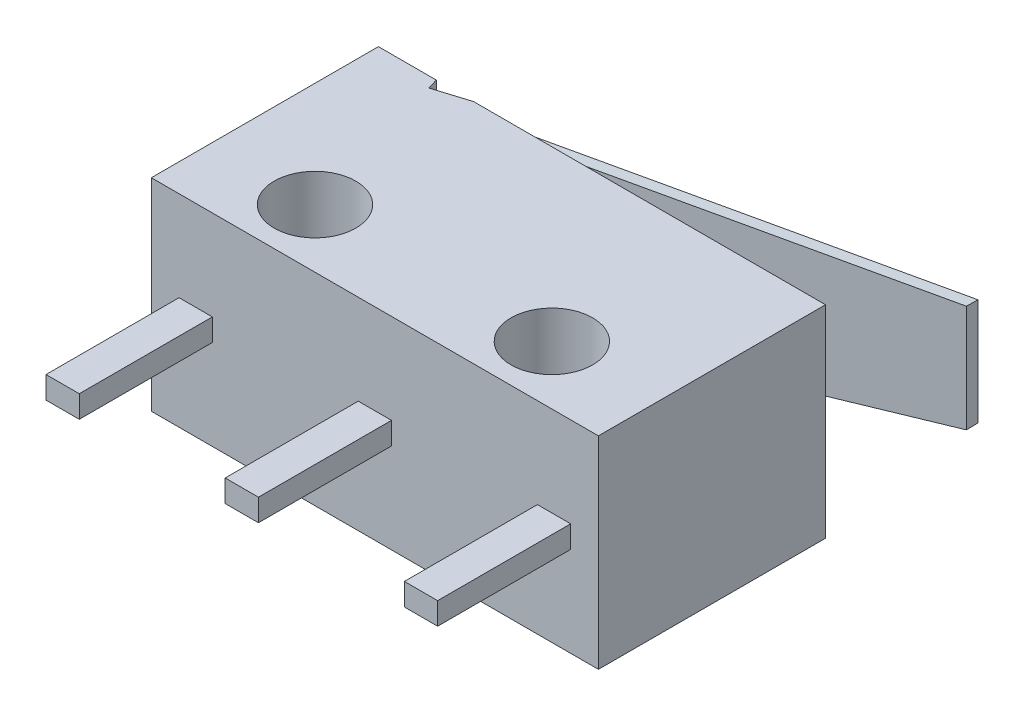
ISO-10303-21;
HEADER;
FILE_DESCRIPTION(('STEP AP214'),'2;1');
FILE_NAME('part.step','',(''),(''),'','','');
FILE_SCHEMA(('AUTOMOTIVE_DESIGN { 1 0 10303 214 1 1 1 1 }'));
ENDSEC;
DATA;
#1=APPLICATION_CONTEXT('core data for automotive mechanical design processes');
#2=APPLICATION_PROTOCOL_DEFINITION('international standard','automotive_design',2000,#1);
#3=PRODUCT_CONTEXT('',#1,'mechanical');
#4=PRODUCT('Part','Part','',(#3));
#5=PRODUCT_RELATED_PRODUCT_CATEGORY('part','',(#4));
#6=PRODUCT_DEFINITION_FORMATION('','',#4);
#7=PRODUCT_DEFINITION_CONTEXT('part definition',#1,'design');
#8=PRODUCT_DEFINITION('design','',#6,#7);
#9=PRODUCT_DEFINITION_SHAPE('','',#8);
#10=(LENGTH_UNIT() NAMED_UNIT(*) SI_UNIT(.MILLI.,.METRE.));
#11=(NAMED_UNIT(*) PLANE_ANGLE_UNIT() SI_UNIT($,.RADIAN.));
#12=(NAMED_UNIT(*) SI_UNIT($,.STERADIAN.) SOLID_ANGLE_UNIT());
#13=UNCERTAINTY_MEASURE_WITH_UNIT(LENGTH_MEASURE(1.E-05),#10,'distance_accuracy_value','');
#14=(GEOMETRIC_REPRESENTATION_CONTEXT(3) GLOBAL_UNCERTAINTY_ASSIGNED_CONTEXT((#13)) GLOBAL_UNIT_ASSIGNED_CONTEXT((#10,
#11,#12)) REPRESENTATION_CONTEXT('',''));
#15=CARTESIAN_POINT('',(0.,0.,0.));
#16=DIRECTION('',(0.,0.,1.));
#17=DIRECTION('',(1.,0.,0.));
#18=AXIS2_PLACEMENT_3D('',#15,#16,#17);
#19=CARTESIAN_POINT('',(-6.4008,5.7912,3.2512));
#20=DIRECTION('',(0.,0.,-1.));
#21=DIRECTION('',(-1.,0.,0.));
#22=AXIS2_PLACEMENT_3D('',#19,#20,#21);
#23=PLANE('',#22);
#24=DIRECTION('',(0.,1.,0.));
#25=VECTOR('',#24,1.);
#26=CARTESIAN_POINT('',(-4.65455,3.2131,3.2512));
#27=LINE('',#26,#25);
#28=CARTESIAN_POINT('',(-4.65455,2.5781,3.2512));
#29=VERTEX_POINT('',#28);
#30=CARTESIAN_POINT('',(-4.65455,3.2131,3.2512));
#31=VERTEX_POINT('',#30);
#32=EDGE_CURVE('E329',#29,#31,#27,.T.);
#33=ORIENTED_EDGE('',*,*,#32,.F.);
#34=DIRECTION('',(1.,0.,0.));
#35=VECTOR('',#34,1.);
#36=CARTESIAN_POINT('',(-5.60705,2.5781,3.2512));
#37=LINE('',#36,#35);
#38=CARTESIAN_POINT('',(-5.60705,2.5781,3.2512));
#39=VERTEX_POINT('',#38);
#40=EDGE_CURVE('E347',#39,#29,#37,.T.);
#41=ORIENTED_EDGE('',*,*,#40,.F.);
#42=DIRECTION('',(0.,-1.,0.));
#43=VECTOR('',#42,1.);
#44=CARTESIAN_POINT('',(-5.60705,3.2131,3.2512));
#45=LINE('',#44,#43);
#46=CARTESIAN_POINT('',(-5.60705,3.2131,3.2512));
#47=VERTEX_POINT('',#46);
#48=EDGE_CURVE('E360',#47,#39,#45,.T.);
#49=ORIENTED_EDGE('',*,*,#48,.F.);
#50=DIRECTION('',(-1.,0.,0.));
#51=VECTOR('',#50,1.);
#52=CARTESIAN_POINT('',(-5.60705,3.2131,3.2512));
#53=LINE('',#52,#51);
#54=EDGE_CURVE('E335',#31,#47,#53,.T.);
#55=ORIENTED_EDGE('',*,*,#54,.F.);
#56=EDGE_LOOP('',(#33,#41,#49,#55));
#57=FACE_BOUND('',#56,.T.);
#58=DIRECTION('',(1.,0.,0.));
#59=VECTOR('',#58,1.);
#60=CARTESIAN_POINT('',(-6.4008,0.,3.2512));
#61=LINE('',#60,#59);
#62=CARTESIAN_POINT('',(-6.4008,0.,3.2512));
#63=VERTEX_POINT('',#62);
#64=CARTESIAN_POINT('',(6.4008,0.,3.2512));
#65=VERTEX_POINT('',#64);
#66=EDGE_CURVE('E587',#63,#65,#61,.T.);
#67=ORIENTED_EDGE('',*,*,#66,.T.);
#68=DIRECTION('',(0.,-1.,0.));
#69=VECTOR('',#68,1.);
#70=CARTESIAN_POINT('',(6.4008,5.7912,3.2512));
#71=LINE('',#70,#69);
#72=CARTESIAN_POINT('',(6.4008,5.7912,3.2512));
#73=VERTEX_POINT('',#72);
#74=EDGE_CURVE('E597',#73,#65,#71,.T.);
#75=ORIENTED_EDGE('',*,*,#74,.F.);
#76=DIRECTION('',(1.,0.,0.));
#77=VECTOR('',#76,1.);
#78=CARTESIAN_POINT('',(-6.4008,5.7912,3.2512));
#79=LINE('',#78,#77);
#80=CARTESIAN_POINT('',(-6.4008,5.7912,3.2512));
#81=VERTEX_POINT('',#80);
#82=EDGE_CURVE('E594',#81,#73,#79,.T.);
#83=ORIENTED_EDGE('',*,*,#82,.F.);
#84=DIRECTION('',(0.,-1.,0.));
#85=VECTOR('',#84,1.);
#86=CARTESIAN_POINT('',(-6.4008,5.7912,3.2512));
#87=LINE('',#86,#85);
#88=EDGE_CURVE('E614',#81,#63,#87,.T.);
#89=ORIENTED_EDGE('',*,*,#88,.T.);
#90=EDGE_LOOP('',(#67,#75,#83,#89));
#91=FACE_BOUND('',#90,.T.);
#92=DIRECTION('',(0.,1.,0.));
#93=VECTOR('',#92,1.);
#94=CARTESIAN_POINT('',(0.476249999999998,3.2131,3.2512));
#95=LINE('',#94,#93);
#96=CARTESIAN_POINT('',(0.476249999999998,2.5781,3.2512));
#97=VERTEX_POINT('',#96);
#98=CARTESIAN_POINT('',(0.476249999999998,3.2131,3.2512));
#99=VERTEX_POINT('',#98);
#100=EDGE_CURVE('E382',#97,#99,#95,.T.);
#101=ORIENTED_EDGE('',*,*,#100,.F.);
#102=DIRECTION('',(1.,0.,0.));
#103=VECTOR('',#102,1.);
#104=CARTESIAN_POINT('',(-0.476250000000003,2.5781,3.2512));
#105=LINE('',#104,#103);
#106=CARTESIAN_POINT('',(-0.476250000000003,2.5781,3.2512));
#107=VERTEX_POINT('',#106);
#108=EDGE_CURVE('E388',#107,#97,#105,.T.);
#109=ORIENTED_EDGE('',*,*,#108,.F.);
#110=DIRECTION('',(0.,-1.,0.));
#111=VECTOR('',#110,1.);
#112=CARTESIAN_POINT('',(-0.476250000000002,3.2131,3.2512));
#113=LINE('',#112,#111);
#114=CARTESIAN_POINT('',(-0.476250000000002,3.2131,3.2512));
#115=VERTEX_POINT('',#114);
#116=EDGE_CURVE('E405',#115,#107,#113,.T.);
#117=ORIENTED_EDGE('',*,*,#116,.F.);
#118=DIRECTION('',(-1.,0.,0.));
#119=VECTOR('',#118,1.);
#120=CARTESIAN_POINT('',(-0.476250000000002,3.2131,3.2512));
#121=LINE('',#120,#119);
#122=EDGE_CURVE('E401',#99,#115,#121,.T.);
#123=ORIENTED_EDGE('',*,*,#122,.F.);
#124=EDGE_LOOP('',(#101,#109,#117,#123));
#125=FACE_BOUND('',#124,.T.);
#126=DIRECTION('',(0.,1.,0.));
#127=VECTOR('',#126,1.);
#128=CARTESIAN_POINT('',(5.60705,3.2131,3.2512));
#129=LINE('',#128,#127);
#130=CARTESIAN_POINT('',(5.60705,2.5781,3.2512));
#131=VERTEX_POINT('',#130);
#132=CARTESIAN_POINT('',(5.60705,3.2131,3.2512));
#133=VERTEX_POINT('',#132);
#134=EDGE_CURVE('E327',#131,#133,#129,.T.);
#135=ORIENTED_EDGE('',*,*,#134,.F.);
#136=DIRECTION('',(1.,0.,0.));
#137=VECTOR('',#136,1.);
#138=CARTESIAN_POINT('',(5.60705,2.5781,3.2512));
#139=LINE('',#138,#137);
#140=CARTESIAN_POINT('',(4.65455,2.5781,3.2512));
#141=VERTEX_POINT('',#140);
#142=EDGE_CURVE('E324',#141,#131,#139,.T.);
#143=ORIENTED_EDGE('',*,*,#142,.F.);
#144=DIRECTION('',(0.,-1.,0.));
#145=VECTOR('',#144,1.);
#146=CARTESIAN_POINT('',(4.65455,3.2131,3.2512));
#147=LINE('',#146,#145);
#148=CARTESIAN_POINT('',(4.65455,3.2131,3.2512));
#149=VERTEX_POINT('',#148);
#150=EDGE_CURVE('E66',#149,#141,#147,.T.);
#151=ORIENTED_EDGE('',*,*,#150,.F.);
#152=DIRECTION('',(-1.,0.,0.));
#153=VECTOR('',#152,1.);
#154=CARTESIAN_POINT('',(5.60705,3.2131,3.2512));
#155=LINE('',#154,#153);
#156=EDGE_CURVE('E58',#133,#149,#155,.T.);
#157=ORIENTED_EDGE('',*,*,#156,.F.);
#158=EDGE_LOOP('',(#135,#143,#151,#157));
#159=FACE_BOUND('',#158,.T.);
#160=ADVANCED_FACE('F39',(#57,#91,#125,#159),#23,.F.);
#161=CARTESIAN_POINT('',(-6.4008,5.7912,-3.2512));
#162=DIRECTION('',(0.,0.,1.));
#163=DIRECTION('',(1.,0.,0.));
#164=AXIS2_PLACEMENT_3D('',#161,#162,#163);
#165=PLANE('',#164);
#166=DIRECTION('',(1.,0.,0.));
#167=VECTOR('',#166,1.);
#168=CARTESIAN_POINT('',(-1.4478,4.6736,-3.2512));
#169=LINE('',#168,#167);
#170=CARTESIAN_POINT('',(-2.4638,4.6736,-3.2512));
#171=VERTEX_POINT('',#170);
#172=CARTESIAN_POINT('',(-1.4478,4.6736,-3.2512));
#173=VERTEX_POINT('',#172);
#174=EDGE_CURVE('E554',#171,#173,#169,.T.);
#175=ORIENTED_EDGE('',*,*,#174,.F.);
#176=DIRECTION('',(0.,1.,0.));
#177=VECTOR('',#176,1.);
#178=CARTESIAN_POINT('',(-2.4638,4.6736,-3.2512));
#179=LINE('',#178,#177);
#180=CARTESIAN_POINT('',(-2.4638,1.1176,-3.2512));
#181=VERTEX_POINT('',#180);
#182=EDGE_CURVE('E551',#181,#171,#179,.T.);
#183=ORIENTED_EDGE('',*,*,#182,.F.);
#184=DIRECTION('',(-1.,0.,0.));
#185=VECTOR('',#184,1.);
#186=CARTESIAN_POINT('',(-1.4478,1.1176,-3.2512));
#187=LINE('',#186,#185);
#188=CARTESIAN_POINT('',(-1.4478,1.1176,-3.2512));
#189=VERTEX_POINT('',#188);
#190=EDGE_CURVE('E561',#189,#181,#187,.T.);
#191=ORIENTED_EDGE('',*,*,#190,.F.);
#192=DIRECTION('',(0.,-1.,0.));
#193=VECTOR('',#192,1.);
#194=CARTESIAN_POINT('',(-1.4478,4.6736,-3.2512));
#195=LINE('',#194,#193);
#196=EDGE_CURVE('E558',#173,#189,#195,.T.);
#197=ORIENTED_EDGE('',*,*,#196,.F.);
#198=EDGE_LOOP('',(#175,#183,#191,#197));
#199=FACE_BOUND('',#198,.T.);
#200=DIRECTION('',(-1.,0.,0.));
#201=VECTOR('',#200,1.);
#202=CARTESIAN_POINT('',(-6.4008,0.,-3.2512));
#203=LINE('',#202,#201);
#204=CARTESIAN_POINT('',(6.4008,0.,-3.2512));
#205=VERTEX_POINT('',#204);
#206=CARTESIAN_POINT('',(-3.67341299428103,0.,-3.2512));
#207=VERTEX_POINT('',#206);
#208=EDGE_CURVE('E602',#205,#207,#203,.T.);
#209=ORIENTED_EDGE('',*,*,#208,.T.);
#210=DIRECTION('',(0.,1.,0.));
#211=VECTOR('',#210,1.);
#212=CARTESIAN_POINT('',(-3.67341299428103,-12.393877288843,-3.2512));
#213=LINE('',#212,#211);
#214=CARTESIAN_POINT('',(-3.67341299428103,0.583500613824504,-3.2512));
#215=VERTEX_POINT('',#214);
#216=EDGE_CURVE('E530',#207,#215,#213,.T.);
#217=ORIENTED_EDGE('',*,*,#216,.T.);
#218=CARTESIAN_POINT('',(-3.67341299428104,1.79809398566603,-3.2512));
#219=VERTEX_POINT('',#218);
#220=EDGE_CURVE('E534',#215,#219,#213,.T.);
#221=ORIENTED_EDGE('',*,*,#220,.T.);
#222=CARTESIAN_POINT('',(-3.67341299428103,3.99310601433397,-3.2512));
#223=VERTEX_POINT('',#222);
#224=EDGE_CURVE('E687',#219,#223,#213,.T.);
#225=ORIENTED_EDGE('',*,*,#224,.T.);
#226=CARTESIAN_POINT('',(-3.67341299428103,5.2076993861755,-3.2512));
#227=VERTEX_POINT('',#226);
#228=EDGE_CURVE('E691',#223,#227,#213,.T.);
#229=ORIENTED_EDGE('',*,*,#228,.T.);
#230=CARTESIAN_POINT('',(-3.67341299428103,5.7912,-3.2512));
#231=VERTEX_POINT('',#230);
#232=EDGE_CURVE('E535',#227,#231,#213,.T.);
#233=ORIENTED_EDGE('',*,*,#232,.T.);
#234=DIRECTION('',(-1.,0.,0.));
#235=VECTOR('',#234,1.);
#236=CARTESIAN_POINT('',(-6.4008,5.7912,-3.2512));
#237=LINE('',#236,#235);
#238=CARTESIAN_POINT('',(6.4008,5.7912,-3.2512));
#239=VERTEX_POINT('',#238);
#240=EDGE_CURVE('E588',#239,#231,#237,.T.);
#241=ORIENTED_EDGE('',*,*,#240,.F.);
#242=DIRECTION('',(0.,-1.,0.));
#243=VECTOR('',#242,1.);
#244=CARTESIAN_POINT('',(6.4008,5.7912,-3.2512));
#245=LINE('',#244,#243);
#246=EDGE_CURVE('E11',#239,#205,#245,.T.);
#247=ORIENTED_EDGE('',*,*,#246,.T.);
#248=EDGE_LOOP('',(#209,#217,#221,#225,#229,#233,#241,#247));
#249=FACE_BOUND('',#248,.T.);
#250=ADVANCED_FACE('F703',(#199,#249),#165,.F.);
#251=CARTESIAN_POINT('',(-4.74408917190015,5.7912,-3.2512));
#252=VERTEX_POINT('',#251);
#253=CARTESIAN_POINT('',(-6.4008,5.7912,-3.2512));
#254=VERTEX_POINT('',#253);
#255=EDGE_CURVE('E586',#252,#254,#237,.T.);
#256=ORIENTED_EDGE('',*,*,#255,.F.);
#257=DIRECTION('',(0.,1.,0.));
#258=VECTOR('',#257,1.);
#259=CARTESIAN_POINT('',(-4.74408917190015,5.27828827236032,-3.2512));
#260=LINE('',#259,#258);
#261=CARTESIAN_POINT('',(-4.74408917190015,5.27828827236032,-3.2512));
#262=VERTEX_POINT('',#261);
#263=EDGE_CURVE('E428',#262,#252,#260,.T.);
#264=ORIENTED_EDGE('',*,*,#263,.F.);
#265=DIRECTION('',(0.,1.,0.));
#266=VECTOR('',#265,1.);
#267=CARTESIAN_POINT('',(-4.74408917190015,-12.393877288843,-3.2512));
#268=LINE('',#267,#266);
#269=CARTESIAN_POINT('',(-4.74408917190015,4.10181579910241,-3.2512));
#270=VERTEX_POINT('',#269);
#271=EDGE_CURVE('E541',#270,#262,#268,.T.);
#272=ORIENTED_EDGE('',*,*,#271,.F.);
#273=DIRECTION('',(0.,1.,0.));
#274=VECTOR('',#273,1.);
#275=CARTESIAN_POINT('',(-4.74408917190015,1.68938420089759,-3.2512));
#276=LINE('',#275,#274);
#277=CARTESIAN_POINT('',(-4.74408917190015,1.68938420089759,-3.2512));
#278=VERTEX_POINT('',#277);
#279=EDGE_CURVE('E455',#278,#270,#276,.T.);
#280=ORIENTED_EDGE('',*,*,#279,.F.);
#281=CARTESIAN_POINT('',(-4.74408917190015,0.512911727639676,-3.2512));
#282=VERTEX_POINT('',#281);
#283=EDGE_CURVE('E540',#282,#278,#268,.T.);
#284=ORIENTED_EDGE('',*,*,#283,.F.);
#285=CARTESIAN_POINT('',(-4.74408917190015,0.,-3.2512));
#286=VERTEX_POINT('',#285);
#287=EDGE_CURVE('E536',#286,#282,#268,.T.);
#288=ORIENTED_EDGE('',*,*,#287,.F.);
#289=CARTESIAN_POINT('',(-6.4008,0.,-3.2512));
#290=VERTEX_POINT('',#289);
#291=EDGE_CURVE('E601',#286,#290,#203,.T.);
#292=ORIENTED_EDGE('',*,*,#291,.T.);
#293=DIRECTION('',(0.,-1.,0.));
#294=VECTOR('',#293,1.);
#295=CARTESIAN_POINT('',(-6.4008,5.7912,-3.2512));
#296=LINE('',#295,#294);
#297=EDGE_CURVE('E48',#254,#290,#296,.T.);
#298=ORIENTED_EDGE('',*,*,#297,.F.);
#299=EDGE_LOOP('',(#256,#264,#272,#280,#284,#288,#292,#298));
#300=FACE_BOUND('',#299,.T.);
#301=ADVANCED_FACE('F648',(#300),#165,.F.);
#302=CARTESIAN_POINT('',(6.4008,5.7912,3.2512));
#303=DIRECTION('',(0.,1.,0.));
#304=DIRECTION('',(0.,0.,1.));
#305=AXIS2_PLACEMENT_3D('',#302,#303,#304);
#306=PLANE('',#305);
#307=DIRECTION('',(0.955019944457186,0.,-0.296541574975572));
#308=VECTOR('',#307,1.);
#309=CARTESIAN_POINT('',(-4.64993722184541,5.7912,-2.94798116763484));
#310=LINE('',#309,#308);
#311=CARTESIAN_POINT('',(-4.64993722184541,5.7912,-2.94798116763484));
#312=VERTEX_POINT('',#311);
#313=EDGE_CURVE('E443',#312,#231,#310,.T.);
#314=ORIENTED_EDGE('',*,*,#313,.F.);
#315=DIRECTION('',(-0.296541574975572,0.,-0.955019944457186));
#316=VECTOR('',#315,1.);
#317=CARTESIAN_POINT('',(-0.952300044516491,5.7912,8.96035664977368));
#318=LINE('',#317,#316);
#319=EDGE_CURVE('E438',#312,#252,#318,.T.);
#320=ORIENTED_EDGE('',*,*,#319,.T.);
#321=ORIENTED_EDGE('',*,*,#255,.T.);
#322=DIRECTION('',(0.,0.,1.));
#323=VECTOR('',#322,1.);
#324=CARTESIAN_POINT('',(-6.4008,5.7912,-3.2512));
#325=LINE('',#324,#323);
#326=EDGE_CURVE('E591',#254,#81,#325,.T.);
#327=ORIENTED_EDGE('',*,*,#326,.T.);
#328=ORIENTED_EDGE('',*,*,#82,.T.);
#329=DIRECTION('',(0.,0.,-1.));
#330=VECTOR('',#329,1.);
#331=CARTESIAN_POINT('',(6.4008,5.7912,-3.2512));
#332=LINE('',#331,#330);
#333=EDGE_CURVE('E582',#73,#239,#332,.T.);
#334=ORIENTED_EDGE('',*,*,#333,.T.);
#335=ORIENTED_EDGE('',*,*,#240,.T.);
#336=EDGE_LOOP('',(#314,#320,#321,#327,#328,#334,#335));
#337=FACE_BOUND('',#336,.T.);
#338=CARTESIAN_POINT('',(3.3909,5.7912,1.5748));
#339=DIRECTION('',(0.,1.,0.));
#340=DIRECTION('',(0.,0.,1.));
#341=AXIS2_PLACEMENT_3D('',#338,#339,#340);
#342=CIRCLE('',#341,1.1684);
#343=CARTESIAN_POINT('',(3.3909,5.7912,2.7432));
#344=VERTEX_POINT('',#343);
#345=EDGE_CURVE('E574',#344,#344,#342,.T.);
#346=ORIENTED_EDGE('',*,*,#345,.F.);
#347=EDGE_LOOP('',(#346));
#348=FACE_BOUND('',#347,.T.);
#349=CARTESIAN_POINT('',(-3.3909,5.7912,1.5748));
#350=DIRECTION('',(0.,1.,0.));
#351=DIRECTION('',(0.,0.,-1.));
#352=AXIS2_PLACEMENT_3D('',#349,#350,#351);
#353=CIRCLE('',#352,1.1684);
#354=CARTESIAN_POINT('',(-3.3909,5.7912,0.406400000000002));
#355=VERTEX_POINT('',#354);
#356=EDGE_CURVE('E566',#355,#355,#353,.T.);
#357=ORIENTED_EDGE('',*,*,#356,.F.);
#358=EDGE_LOOP('',(#357));
#359=FACE_BOUND('',#358,.T.);
#360=ADVANCED_FACE('F644',(#337,#348,#359),#306,.T.);
#361=CARTESIAN_POINT('',(6.4008,0.,3.2512));
#362=DIRECTION('',(0.,1.,0.));
#363=DIRECTION('',(0.,0.,1.));
#364=AXIS2_PLACEMENT_3D('',#361,#362,#363);
#365=PLANE('',#364);
#366=CARTESIAN_POINT('',(3.3909,0.,1.5748));
#367=DIRECTION('',(0.,1.,0.));
#368=DIRECTION('',(0.,0.,1.));
#369=AXIS2_PLACEMENT_3D('',#366,#367,#368);
#370=CIRCLE('',#369,1.1684);
#371=CARTESIAN_POINT('',(3.3909,0.,2.7432));
#372=VERTEX_POINT('',#371);
#373=EDGE_CURVE('E570',#372,#372,#370,.T.);
#374=ORIENTED_EDGE('',*,*,#373,.T.);
#375=EDGE_LOOP('',(#374));
#376=FACE_BOUND('',#375,.T.);
#377=DIRECTION('',(-0.296541574975572,0.,-0.955019944457186));
#378=VECTOR('',#377,1.);
#379=CARTESIAN_POINT('',(-0.952300044516491,0.,8.96035664977368));
#380=LINE('',#379,#378);
#381=CARTESIAN_POINT('',(-4.64993722184541,0.,-2.94798116763484));
#382=VERTEX_POINT('',#381);
#383=EDGE_CURVE('E514',#382,#286,#380,.T.);
#384=ORIENTED_EDGE('',*,*,#383,.F.);
#385=DIRECTION('',(-0.955019944457186,0.,0.296541574975572));
#386=VECTOR('',#385,1.);
#387=CARTESIAN_POINT('',(-4.64993722184541,0.,-2.94798116763484));
#388=LINE('',#387,#386);
#389=EDGE_CURVE('E508',#207,#382,#388,.T.);
#390=ORIENTED_EDGE('',*,*,#389,.F.);
#391=ORIENTED_EDGE('',*,*,#208,.F.);
#392=DIRECTION('',(0.,0.,-1.));
#393=VECTOR('',#392,1.);
#394=CARTESIAN_POINT('',(6.4008,0.,-3.2512));
#395=LINE('',#394,#393);
#396=EDGE_CURVE('E578',#65,#205,#395,.T.);
#397=ORIENTED_EDGE('',*,*,#396,.F.);
#398=ORIENTED_EDGE('',*,*,#66,.F.);
#399=DIRECTION('',(0.,0.,1.));
#400=VECTOR('',#399,1.);
#401=CARTESIAN_POINT('',(-6.4008,0.,-3.2512));
#402=LINE('',#401,#400);
#403=EDGE_CURVE('E606',#290,#63,#402,.T.);
#404=ORIENTED_EDGE('',*,*,#403,.F.);
#405=ORIENTED_EDGE('',*,*,#291,.F.);
#406=EDGE_LOOP('',(#384,#390,#391,#397,#398,#404,#405));
#407=FACE_BOUND('',#406,.T.);
#408=CARTESIAN_POINT('',(-3.3909,0.,1.5748));
#409=DIRECTION('',(0.,1.,0.));
#410=DIRECTION('',(0.,0.,-1.));
#411=AXIS2_PLACEMENT_3D('',#408,#409,#410);
#412=CIRCLE('',#411,1.1684);
#413=CARTESIAN_POINT('',(-3.3909,0.,0.406400000000002));
#414=VERTEX_POINT('',#413);
#415=EDGE_CURVE('E565',#414,#414,#412,.T.);
#416=ORIENTED_EDGE('',*,*,#415,.T.);
#417=EDGE_LOOP('',(#416));
#418=FACE_BOUND('',#417,.T.);
#419=ADVANCED_FACE('F631',(#376,#407,#418),#365,.F.);
#420=CARTESIAN_POINT('',(6.4008,5.7912,-3.2512));
#421=DIRECTION('',(-1.,0.,0.));
#422=DIRECTION('',(0.,0.,1.));
#423=AXIS2_PLACEMENT_3D('',#420,#421,#422);
#424=PLANE('',#423);
#425=ORIENTED_EDGE('',*,*,#396,.T.);
#426=ORIENTED_EDGE('',*,*,#246,.F.);
#427=ORIENTED_EDGE('',*,*,#333,.F.);
#428=ORIENTED_EDGE('',*,*,#74,.T.);
#429=EDGE_LOOP('',(#425,#426,#427,#428));
#430=FACE_BOUND('',#429,.T.);
#431=ADVANCED_FACE('F41',(#430),#424,.F.);
#432=CARTESIAN_POINT('',(-6.4008,5.7912,-3.2512));
#433=DIRECTION('',(1.,0.,0.));
#434=DIRECTION('',(0.,0.,-1.));
#435=AXIS2_PLACEMENT_3D('',#432,#433,#434);
#436=PLANE('',#435);
#437=ORIENTED_EDGE('',*,*,#403,.T.);
#438=ORIENTED_EDGE('',*,*,#88,.F.);
#439=ORIENTED_EDGE('',*,*,#326,.F.);
#440=ORIENTED_EDGE('',*,*,#297,.T.);
#441=EDGE_LOOP('',(#437,#438,#439,#440));
#442=FACE_BOUND('',#441,.T.);
#443=ADVANCED_FACE('F623',(#442),#436,.F.);
#444=CARTESIAN_POINT('',(3.3909,5.7912,1.5748));
#445=DIRECTION('',(0.,-1.,0.));
#446=DIRECTION('',(0.,0.,-1.));
#447=AXIS2_PLACEMENT_3D('',#444,#445,#446);
#448=CYLINDRICAL_SURFACE('',#447,1.1684);
#449=ORIENTED_EDGE('',*,*,#345,.T.);
#450=EDGE_LOOP('',(#449));
#451=FACE_BOUND('',#450,.T.);
#452=ORIENTED_EDGE('',*,*,#373,.F.);
#453=EDGE_LOOP('',(#452));
#454=FACE_BOUND('',#453,.T.);
#455=ADVANCED_FACE('F742',(#451,#454),#448,.F.);
#456=CARTESIAN_POINT('',(-3.3909,5.7912,1.5748));
#457=DIRECTION('',(0.,-1.,0.));
#458=DIRECTION('',(0.,0.,-1.));
#459=AXIS2_PLACEMENT_3D('',#456,#457,#458);
#460=CYLINDRICAL_SURFACE('',#459,1.1684);
#461=ORIENTED_EDGE('',*,*,#356,.T.);
#462=EDGE_LOOP('',(#461));
#463=FACE_BOUND('',#462,.T.);
#464=ORIENTED_EDGE('',*,*,#415,.F.);
#465=EDGE_LOOP('',(#464));
#466=FACE_BOUND('',#465,.T.);
#467=ADVANCED_FACE('F754',(#463,#466),#460,.F.);
#468=CARTESIAN_POINT('',(-1.4478,4.6736,-4.5212));
#469=DIRECTION('',(0.,-1.,0.));
#470=DIRECTION('',(0.,0.,-1.));
#471=AXIS2_PLACEMENT_3D('',#468,#469,#470);
#472=PLANE('',#471);
#473=ORIENTED_EDGE('',*,*,#174,.T.);
#474=CARTESIAN_POINT('',(-1.9558,4.6736,-3.2512));
#475=DIRECTION('',(0.,-1.,0.));
#476=DIRECTION('',(0.,0.,-1.));
#477=AXIS2_PLACEMENT_3D('',#474,#475,#476);
#478=CIRCLE('',#477,0.508);
#479=EDGE_CURVE('E547',#173,#171,#478,.F.);
#480=ORIENTED_EDGE('',*,*,#479,.T.);
#481=EDGE_LOOP('',(#473,#480));
#482=FACE_BOUND('',#481,.T.);
#483=ADVANCED_FACE('F758',(#482),#472,.F.);
#484=CARTESIAN_POINT('',(-1.4478,1.1176,-4.5212));
#485=DIRECTION('',(0.,1.,0.));
#486=DIRECTION('',(0.,0.,1.));
#487=AXIS2_PLACEMENT_3D('',#484,#485,#486);
#488=PLANE('',#487);
#489=ORIENTED_EDGE('',*,*,#190,.T.);
#490=CARTESIAN_POINT('',(-1.9558,1.1176,-3.2512));
#491=DIRECTION('',(0.,1.,0.));
#492=DIRECTION('',(0.,0.,-1.));
#493=AXIS2_PLACEMENT_3D('',#490,#491,#492);
#494=CIRCLE('',#493,0.508);
#495=EDGE_CURVE('E529',#189,#181,#494,.T.);
#496=ORIENTED_EDGE('',*,*,#495,.F.);
#497=EDGE_LOOP('',(#489,#496));
#498=FACE_BOUND('',#497,.T.);
#499=ADVANCED_FACE('F762',(#498),#488,.F.);
#500=CARTESIAN_POINT('',(-1.9558,5.4356,-3.2512));
#501=DIRECTION('',(0.,-1.,0.));
#502=DIRECTION('',(0.,0.,-1.));
#503=AXIS2_PLACEMENT_3D('',#500,#501,#502);
#504=CYLINDRICAL_SURFACE('',#503,0.508);
#505=ORIENTED_EDGE('',*,*,#196,.T.);
#506=ORIENTED_EDGE('',*,*,#495,.T.);
#507=ORIENTED_EDGE('',*,*,#182,.T.);
#508=ORIENTED_EDGE('',*,*,#479,.F.);
#509=EDGE_LOOP('',(#505,#506,#507,#508));
#510=FACE_BOUND('',#509,.T.);
#511=ADVANCED_FACE('F766',(#510),#504,.T.);
#512=CARTESIAN_POINT('',(7.09231082809985,-12.393877288843,-6.92649989128747));
#513=DIRECTION('',(1.,0.,0.));
#514=DIRECTION('',(0.,0.,-1.));
#515=AXIS2_PLACEMENT_3D('',#512,#513,#514);
#516=PLANE('',#515);
#517=DIRECTION('',(0.,-0.0204672904986655,-0.999790523069529));
#518=VECTOR('',#517,1.);
#519=CARTESIAN_POINT('',(7.09231082809985,4.41563938357627,-7.27061723680929));
#520=LINE('',#519,#518);
#521=CARTESIAN_POINT('',(7.09231082809985,4.42948986290461,-6.59404610135069));
#522=VERTEX_POINT('',#521);
#523=CARTESIAN_POINT('',(7.09231082809985,4.4226840089392,-6.92649989128747));
#524=VERTEX_POINT('',#523);
#525=EDGE_CURVE('E452',#522,#524,#520,.T.);
#526=ORIENTED_EDGE('',*,*,#525,.F.);
#527=DIRECTION('',(0.,1.,0.));
#528=VECTOR('',#527,1.);
#529=CARTESIAN_POINT('',(7.09231082809985,-12.393877288843,-6.59404610135069));
#530=LINE('',#529,#528);
#531=CARTESIAN_POINT('',(7.09231082809985,1.36171013709539,-6.59404610135069));
#532=VERTEX_POINT('',#531);
#533=EDGE_CURVE('E525',#532,#522,#530,.T.);
#534=ORIENTED_EDGE('',*,*,#533,.F.);
#535=DIRECTION('',(0.,-0.0204672904986655,0.999790523069529));
#536=VECTOR('',#535,1.);
#537=CARTESIAN_POINT('',(7.09231082809985,1.36275078716226,-6.6448799953024));
#538=LINE('',#537,#536);
#539=CARTESIAN_POINT('',(7.09231082809985,1.3685159910608,-6.92649989128747));
#540=VERTEX_POINT('',#539);
#541=EDGE_CURVE('E521',#540,#532,#538,.T.);
#542=ORIENTED_EDGE('',*,*,#541,.F.);
#543=DIRECTION('',(0.,1.,0.));
#544=VECTOR('',#543,1.);
#545=CARTESIAN_POINT('',(7.09231082809985,-12.393877288843,-6.92649989128747));
#546=LINE('',#545,#544);
#547=EDGE_CURVE('E524',#540,#524,#546,.T.);
#548=ORIENTED_EDGE('',*,*,#547,.T.);
#549=EDGE_LOOP('',(#526,#534,#542,#548));
#550=FACE_BOUND('',#549,.T.);
#551=ADVANCED_FACE('F770',(#550),#516,.T.);
#552=CARTESIAN_POINT('',(7.09231082809985,-12.393877288843,-6.59404610135069));
#553=DIRECTION('',(0.296541574975572,0.,0.955019944457186));
#554=DIRECTION('',(0.955019944457186,0.,-0.296541574975572));
#555=AXIS2_PLACEMENT_3D('',#552,#553,#554);
#556=PLANE('',#555);
#557=DIRECTION('',(-0.952752351929205,0.0688705158912452,0.295837468780143));
#558=VECTOR('',#557,1.);
#559=CARTESIAN_POINT('',(-4.64993722184541,5.27828827236032,-2.94798116763484));
#560=LINE('',#559,#558);
#561=EDGE_CURVE('E442',#522,#227,#560,.T.);
#562=ORIENTED_EDGE('',*,*,#561,.T.);
#563=ORIENTED_EDGE('',*,*,#228,.F.);
#564=DIRECTION('',(0.94966794760925,-0.105720058214615,-0.294879735781781));
#565=VECTOR('',#564,1.);
#566=CARTESIAN_POINT('',(-4.64993722184541,4.10181579910241,-2.94798116763484));
#567=LINE('',#566,#565);
#568=CARTESIAN_POINT('',(-0.392338629777181,3.62784637416703,-4.27000067040376));
#569=VERTEX_POINT('',#568);
#570=EDGE_CURVE('E459',#223,#569,#567,.T.);
#571=ORIENTED_EDGE('',*,*,#570,.T.);
#572=CARTESIAN_POINT('',(-0.466686361983369,2.8956,-4.2469150859275));
#573=DIRECTION('',(0.296541574975572,0.,0.955019944457186));
#574=DIRECTION('',(0.955019944457186,0.,-0.296541574975572));
#575=AXIS2_PLACEMENT_3D('',#572,#573,#574);
#576=CIRCLE('',#575,0.736373058969145);
#577=CARTESIAN_POINT('',(-0.392338629777183,2.16335362583297,-4.27000067040376));
#578=VERTEX_POINT('',#577);
#579=EDGE_CURVE('E486',#569,#578,#576,.F.);
#580=ORIENTED_EDGE('',*,*,#579,.T.);
#581=DIRECTION('',(-0.94966794760925,-0.105720058214615,0.294879735781781));
#582=VECTOR('',#581,1.);
#583=CARTESIAN_POINT('',(-4.64993722184541,1.68938420089759,-2.94798116763484));
#584=LINE('',#583,#582);
#585=EDGE_CURVE('E481',#578,#219,#584,.T.);
#586=ORIENTED_EDGE('',*,*,#585,.T.);
#587=ORIENTED_EDGE('',*,*,#220,.F.);
#588=DIRECTION('',(0.952752351929205,0.0688705158912452,-0.295837468780143));
#589=VECTOR('',#588,1.);
#590=CARTESIAN_POINT('',(-4.64993722184541,0.512911727639676,-2.94798116763484));
#591=LINE('',#590,#589);
#592=EDGE_CURVE('E503',#215,#532,#591,.T.);
#593=ORIENTED_EDGE('',*,*,#592,.T.);
#594=ORIENTED_EDGE('',*,*,#533,.T.);
#595=EDGE_LOOP('',(#562,#563,#571,#580,#586,#587,#593,#594));
#596=FACE_BOUND('',#595,.T.);
#597=ADVANCED_FACE('F695',(#596),#556,.T.);
#598=CARTESIAN_POINT('',(-4.74408917190015,-12.393877288843,-3.2512));
#599=DIRECTION('',(-0.296541574975572,0.,-0.955019944457186));
#600=DIRECTION('',(-0.955019944457186,0.,0.296541574975572));
#601=AXIS2_PLACEMENT_3D('',#598,#599,#600);
#602=PLANE('',#601);
#603=DIRECTION('',(-0.952752351929205,0.0688705158912452,0.295837468780143));
#604=VECTOR('',#603,1.);
#605=CARTESIAN_POINT('',(-4.74408917190015,5.27828827236032,-3.2512));
#606=LINE('',#605,#604);
#607=EDGE_CURVE('E427',#524,#262,#606,.T.);
#608=ORIENTED_EDGE('',*,*,#607,.F.);
#609=ORIENTED_EDGE('',*,*,#547,.F.);
#610=DIRECTION('',(0.952752351929205,0.0688705158912452,-0.295837468780143));
#611=VECTOR('',#610,1.);
#612=CARTESIAN_POINT('',(-4.74408917190015,0.512911727639676,-3.2512));
#613=LINE('',#612,#611);
#614=EDGE_CURVE('E500',#282,#540,#613,.T.);
#615=ORIENTED_EDGE('',*,*,#614,.F.);
#616=ORIENTED_EDGE('',*,*,#283,.T.);
#617=DIRECTION('',(-0.94966794760925,-0.105720058214615,0.294879735781781));
#618=VECTOR('',#617,1.);
#619=CARTESIAN_POINT('',(-4.74408917190015,1.68938420089759,-3.2512));
#620=LINE('',#619,#618);
#621=CARTESIAN_POINT('',(-0.486490579831927,2.16335362583297,-4.57321950276892));
#622=VERTEX_POINT('',#621);
#623=EDGE_CURVE('E456',#622,#278,#620,.T.);
#624=ORIENTED_EDGE('',*,*,#623,.F.);
#625=CARTESIAN_POINT('',(-0.560838312038113,2.8956,-4.55013391829266));
#626=DIRECTION('',(-0.296541574975572,0.,-0.955019944457186));
#627=DIRECTION('',(0.955019944457186,0.,-0.296541574975572));
#628=AXIS2_PLACEMENT_3D('',#625,#626,#627);
#629=CIRCLE('',#628,0.736373058969145);
#630=CARTESIAN_POINT('',(-0.486490579831928,3.62784637416703,-4.57321950276892));
#631=VERTEX_POINT('',#630);
#632=EDGE_CURVE('E460',#631,#622,#629,.T.);
#633=ORIENTED_EDGE('',*,*,#632,.F.);
#634=DIRECTION('',(0.94966794760925,-0.105720058214615,-0.294879735781781));
#635=VECTOR('',#634,1.);
#636=CARTESIAN_POINT('',(-4.74408917190015,4.10181579910241,-3.2512));
#637=LINE('',#636,#635);
#638=EDGE_CURVE('E464',#270,#631,#637,.T.);
#639=ORIENTED_EDGE('',*,*,#638,.F.);
#640=ORIENTED_EDGE('',*,*,#271,.T.);
#641=EDGE_LOOP('',(#608,#609,#615,#616,#624,#633,#639,#640));
#642=FACE_BOUND('',#641,.T.);
#643=ADVANCED_FACE('F656',(#642),#602,.T.);
#644=CARTESIAN_POINT('',(7.09231082809985,-12.393877288843,-6.59404610135069));
#645=DIRECTION('',(0.296541574975572,0.,0.955019944457186));
#646=DIRECTION('',(0.955019944457186,0.,-0.296541574975572));
#647=AXIS2_PLACEMENT_3D('',#644,#645,#646);
#648=PLANE('',#647);
#649=ORIENTED_EDGE('',*,*,#389,.T.);
#650=DIRECTION('',(0.,1.,0.));
#651=VECTOR('',#650,1.);
#652=CARTESIAN_POINT('',(-4.64993722184541,0.512911727639676,-2.94798116763484));
#653=LINE('',#652,#651);
#654=CARTESIAN_POINT('',(-4.64993722184541,0.512911727639676,-2.94798116763484));
#655=VERTEX_POINT('',#654);
#656=EDGE_CURVE('E509',#382,#655,#653,.T.);
#657=ORIENTED_EDGE('',*,*,#656,.T.);
#658=EDGE_CURVE('E504',#655,#215,#591,.T.);
#659=ORIENTED_EDGE('',*,*,#658,.T.);
#660=ORIENTED_EDGE('',*,*,#216,.F.);
#661=EDGE_LOOP('',(#649,#657,#659,#660));
#662=FACE_BOUND('',#661,.T.);
#663=ADVANCED_FACE('F777',(#662),#648,.F.);
#664=CARTESIAN_POINT('',(-0.952300044516491,0.512911727639676,8.96035664977368));
#665=DIRECTION('',(-0.0657727162611947,0.997625607149733,0.02042297125177));
#666=DIRECTION('',(-0.997833725956824,-0.065786437379768,0.));
#667=AXIS2_PLACEMENT_3D('',#664,#665,#666);
#668=PLANE('',#667);
#669=ORIENTED_EDGE('',*,*,#541,.T.);
#670=ORIENTED_EDGE('',*,*,#592,.F.);
#671=ORIENTED_EDGE('',*,*,#658,.F.);
#672=DIRECTION('',(-0.296541574975572,0.,-0.955019944457186));
#673=VECTOR('',#672,1.);
#674=CARTESIAN_POINT('',(-0.952300044516491,0.512911727639676,8.96035664977368));
#675=LINE('',#674,#673);
#676=EDGE_CURVE('E513',#655,#282,#675,.T.);
#677=ORIENTED_EDGE('',*,*,#676,.T.);
#678=ORIENTED_EDGE('',*,*,#614,.T.);
#679=EDGE_LOOP('',(#669,#670,#671,#677,#678));
#680=FACE_BOUND('',#679,.T.);
#681=ADVANCED_FACE('F782',(#680),#668,.F.);
#682=CARTESIAN_POINT('',(-0.952300044516491,0.512911727639676,8.96035664977368));
#683=DIRECTION('',(-0.955019944457186,0.,0.296541574975572));
#684=DIRECTION('',(0.296541574975572,0.,0.955019944457186));
#685=AXIS2_PLACEMENT_3D('',#682,#683,#684);
#686=PLANE('',#685);
#687=ORIENTED_EDGE('',*,*,#383,.T.);
#688=ORIENTED_EDGE('',*,*,#287,.T.);
#689=ORIENTED_EDGE('',*,*,#676,.F.);
#690=ORIENTED_EDGE('',*,*,#656,.F.);
#691=EDGE_LOOP('',(#687,#688,#689,#690));
#692=FACE_BOUND('',#691,.T.);
#693=ADVANCED_FACE('F786',(#692),#686,.F.);
#694=CARTESIAN_POINT('',(7.09231082809985,-12.393877288843,-6.59404610135069));
#695=DIRECTION('',(0.296541574975572,0.,0.955019944457186));
#696=DIRECTION('',(0.955019944457186,0.,-0.296541574975572));
#697=AXIS2_PLACEMENT_3D('',#694,#695,#696);
#698=PLANE('',#697);
#699=CARTESIAN_POINT('',(-4.64993722184541,1.68938420089759,-2.94798116763484));
#700=VERTEX_POINT('',#699);
#701=EDGE_CURVE('E485',#219,#700,#584,.T.);
#702=ORIENTED_EDGE('',*,*,#701,.T.);
#703=DIRECTION('',(0.,1.,0.));
#704=VECTOR('',#703,1.);
#705=CARTESIAN_POINT('',(-4.64993722184541,1.68938420089759,-2.94798116763484));
#706=LINE('',#705,#704);
#707=CARTESIAN_POINT('',(-4.64993722184541,4.10181579910241,-2.94798116763484));
#708=VERTEX_POINT('',#707);
#709=EDGE_CURVE('E475',#700,#708,#706,.T.);
#710=ORIENTED_EDGE('',*,*,#709,.T.);
#711=EDGE_CURVE('E471',#708,#223,#567,.T.);
#712=ORIENTED_EDGE('',*,*,#711,.T.);
#713=ORIENTED_EDGE('',*,*,#224,.F.);
#714=EDGE_LOOP('',(#702,#710,#712,#713));
#715=FACE_BOUND('',#714,.T.);
#716=ADVANCED_FACE('F685',(#715),#698,.F.);
#717=CARTESIAN_POINT('',(-0.952300044516491,4.10181579910241,8.96035664977368));
#718=DIRECTION('',(0.100964764124132,0.994395931855666,-0.0313503925694711));
#719=DIRECTION('',(-0.994884961952598,0.101014417191693,0.));
#720=AXIS2_PLACEMENT_3D('',#717,#718,#719);
#721=PLANE('',#720);
#722=DIRECTION('',(-0.296541574975572,0.,-0.955019944457186));
#723=VECTOR('',#722,1.);
#724=CARTESIAN_POINT('',(-0.952300044516491,4.10181579910241,8.96035664977368));
#725=LINE('',#724,#723);
#726=EDGE_CURVE('E479',#708,#270,#725,.T.);
#727=ORIENTED_EDGE('',*,*,#726,.T.);
#728=ORIENTED_EDGE('',*,*,#638,.T.);
#729=DIRECTION('',(-0.296541574975572,0.,-0.955019944457186));
#730=VECTOR('',#729,1.);
#731=CARTESIAN_POINT('',(3.30529854755173,3.62784637416703,7.63833714700476));
#732=LINE('',#731,#730);
#733=EDGE_CURVE('E474',#569,#631,#732,.T.);
#734=ORIENTED_EDGE('',*,*,#733,.F.);
#735=ORIENTED_EDGE('',*,*,#570,.F.);
#736=ORIENTED_EDGE('',*,*,#711,.F.);
#737=EDGE_LOOP('',(#727,#728,#734,#735,#736));
#738=FACE_BOUND('',#737,.T.);
#739=ADVANCED_FACE('F682',(#738),#721,.F.);
#740=CARTESIAN_POINT('',(3.23095081534555,2.8956,7.66142273148103));
#741=DIRECTION('',(-0.296541574975572,0.,-0.955019944457186));
#742=DIRECTION('',(-0.955019944457186,0.,0.296541574975572));
#743=AXIS2_PLACEMENT_3D('',#740,#741,#742);
#744=CYLINDRICAL_SURFACE('',#743,0.736373058969145);
#745=ORIENTED_EDGE('',*,*,#733,.T.);
#746=ORIENTED_EDGE('',*,*,#632,.T.);
#747=DIRECTION('',(-0.296541574975572,0.,-0.955019944457186));
#748=VECTOR('',#747,1.);
#749=CARTESIAN_POINT('',(3.30529854755174,2.16335362583297,7.63833714700476));
#750=LINE('',#749,#748);
#751=EDGE_CURVE('E490',#578,#622,#750,.T.);
#752=ORIENTED_EDGE('',*,*,#751,.F.);
#753=ORIENTED_EDGE('',*,*,#579,.F.);
#754=EDGE_LOOP('',(#745,#746,#752,#753));
#755=FACE_BOUND('',#754,.T.);
#756=ADVANCED_FACE('F678',(#755),#744,.F.);
#757=CARTESIAN_POINT('',(-0.952300044516491,1.68938420089759,8.96035664977368));
#758=DIRECTION('',(0.100964764124132,-0.994395931855666,-0.0313503925694711));
#759=DIRECTION('',(0.994884961952598,0.101014417191693,0.));
#760=AXIS2_PLACEMENT_3D('',#757,#758,#759);
#761=PLANE('',#760);
#762=ORIENTED_EDGE('',*,*,#751,.T.);
#763=ORIENTED_EDGE('',*,*,#623,.T.);
#764=DIRECTION('',(-0.296541574975572,0.,-0.955019944457186));
#765=VECTOR('',#764,1.);
#766=CARTESIAN_POINT('',(-0.952300044516491,1.68938420089759,8.96035664977368));
#767=LINE('',#766,#765);
#768=EDGE_CURVE('E480',#700,#278,#767,.T.);
#769=ORIENTED_EDGE('',*,*,#768,.F.);
#770=ORIENTED_EDGE('',*,*,#701,.F.);
#771=ORIENTED_EDGE('',*,*,#585,.F.);
#772=EDGE_LOOP('',(#762,#763,#769,#770,#771));
#773=FACE_BOUND('',#772,.T.);
#774=ADVANCED_FACE('F674',(#773),#761,.F.);
#775=CARTESIAN_POINT('',(-0.952300044516491,1.68938420089759,8.96035664977368));
#776=DIRECTION('',(-0.955019944457186,0.,0.296541574975572));
#777=DIRECTION('',(0.296541574975572,0.,0.955019944457186));
#778=AXIS2_PLACEMENT_3D('',#775,#776,#777);
#779=PLANE('',#778);
#780=ORIENTED_EDGE('',*,*,#768,.T.);
#781=ORIENTED_EDGE('',*,*,#279,.T.);
#782=ORIENTED_EDGE('',*,*,#726,.F.);
#783=ORIENTED_EDGE('',*,*,#709,.F.);
#784=EDGE_LOOP('',(#780,#781,#782,#783));
#785=FACE_BOUND('',#784,.T.);
#786=ADVANCED_FACE('F670',(#785),#779,.F.);
#787=CARTESIAN_POINT('',(7.09231082809985,-12.393877288843,-6.59404610135069));
#788=DIRECTION('',(0.296541574975572,0.,0.955019944457186));
#789=DIRECTION('',(0.955019944457186,0.,-0.296541574975572));
#790=AXIS2_PLACEMENT_3D('',#787,#788,#789);
#791=PLANE('',#790);
#792=CARTESIAN_POINT('',(-4.64993722184541,5.27828827236032,-2.94798116763484));
#793=VERTEX_POINT('',#792);
#794=EDGE_CURVE('E439',#227,#793,#560,.T.);
#795=ORIENTED_EDGE('',*,*,#794,.T.);
#796=DIRECTION('',(0.,1.,0.));
#797=VECTOR('',#796,1.);
#798=CARTESIAN_POINT('',(-4.64993722184541,5.27828827236032,-2.94798116763484));
#799=LINE('',#798,#797);
#800=EDGE_CURVE('E431',#793,#312,#799,.T.);
#801=ORIENTED_EDGE('',*,*,#800,.T.);
#802=ORIENTED_EDGE('',*,*,#313,.T.);
#803=ORIENTED_EDGE('',*,*,#232,.F.);
#804=EDGE_LOOP('',(#795,#801,#802,#803));
#805=FACE_BOUND('',#804,.T.);
#806=ADVANCED_FACE('F801',(#805),#791,.F.);
#807=CARTESIAN_POINT('',(-0.952300044516491,5.27828827236032,8.96035664977368));
#808=DIRECTION('',(-0.955019944457186,0.,0.296541574975572));
#809=DIRECTION('',(0.296541574975572,0.,0.955019944457186));
#810=AXIS2_PLACEMENT_3D('',#807,#808,#809);
#811=PLANE('',#810);
#812=DIRECTION('',(-0.296541574975572,0.,-0.955019944457186));
#813=VECTOR('',#812,1.);
#814=CARTESIAN_POINT('',(-0.952300044516491,5.27828827236032,8.96035664977368));
#815=LINE('',#814,#813);
#816=EDGE_CURVE('E449',#793,#262,#815,.T.);
#817=ORIENTED_EDGE('',*,*,#816,.T.);
#818=ORIENTED_EDGE('',*,*,#263,.T.);
#819=ORIENTED_EDGE('',*,*,#319,.F.);
#820=ORIENTED_EDGE('',*,*,#800,.F.);
#821=EDGE_LOOP('',(#817,#818,#819,#820));
#822=FACE_BOUND('',#821,.T.);
#823=ADVANCED_FACE('F804',(#822),#811,.F.);
#824=CARTESIAN_POINT('',(-0.952300044516491,5.27828827236032,8.96035664977368));
#825=DIRECTION('',(-0.0657727162611947,-0.997625607149733,0.02042297125177));
#826=DIRECTION('',(0.997833725956824,-0.065786437379768,0.));
#827=AXIS2_PLACEMENT_3D('',#824,#825,#826);
#828=PLANE('',#827);
#829=ORIENTED_EDGE('',*,*,#525,.T.);
#830=ORIENTED_EDGE('',*,*,#607,.T.);
#831=ORIENTED_EDGE('',*,*,#816,.F.);
#832=ORIENTED_EDGE('',*,*,#794,.F.);
#833=ORIENTED_EDGE('',*,*,#561,.F.);
#834=EDGE_LOOP('',(#829,#830,#831,#832,#833));
#835=FACE_BOUND('',#834,.T.);
#836=ADVANCED_FACE('F808',(#835),#828,.F.);
#837=CARTESIAN_POINT('',(0.476249999999998,3.2131,7.0612));
#838=DIRECTION('',(-1.,0.,0.));
#839=DIRECTION('',(0.,0.,1.));
#840=AXIS2_PLACEMENT_3D('',#837,#838,#839);
#841=PLANE('',#840);
#842=ORIENTED_EDGE('',*,*,#100,.T.);
#843=DIRECTION('',(0.,0.,-1.));
#844=VECTOR('',#843,1.);
#845=CARTESIAN_POINT('',(0.476249999999998,3.2131,7.0612));
#846=LINE('',#845,#844);
#847=CARTESIAN_POINT('',(0.476249999999998,3.2131,7.0612));
#848=VERTEX_POINT('',#847);
#849=EDGE_CURVE('E423',#848,#99,#846,.T.);
#850=ORIENTED_EDGE('',*,*,#849,.F.);
#851=DIRECTION('',(0.,1.,0.));
#852=VECTOR('',#851,1.);
#853=CARTESIAN_POINT('',(0.476249999999998,3.2131,7.0612));
#854=LINE('',#853,#852);
#855=CARTESIAN_POINT('',(0.476249999999998,2.5781,7.0612));
#856=VERTEX_POINT('',#855);
#857=EDGE_CURVE('E383',#856,#848,#854,.T.);
#858=ORIENTED_EDGE('',*,*,#857,.F.);
#859=DIRECTION('',(0.,0.,-1.));
#860=VECTOR('',#859,1.);
#861=CARTESIAN_POINT('',(0.476249999999998,2.5781,7.0612));
#862=LINE('',#861,#860);
#863=EDGE_CURVE('E397',#856,#97,#862,.T.);
#864=ORIENTED_EDGE('',*,*,#863,.T.);
#865=EDGE_LOOP('',(#842,#850,#858,#864));
#866=FACE_BOUND('',#865,.T.);
#867=ADVANCED_FACE('F811',(#866),#841,.F.);
#868=CARTESIAN_POINT('',(-0.476250000000002,3.2131,7.0612));
#869=DIRECTION('',(0.,-1.,0.));
#870=DIRECTION('',(0.,0.,-1.));
#871=AXIS2_PLACEMENT_3D('',#868,#869,#870);
#872=PLANE('',#871);
#873=ORIENTED_EDGE('',*,*,#122,.T.);
#874=DIRECTION('',(0.,0.,-1.));
#875=VECTOR('',#874,1.);
#876=CARTESIAN_POINT('',(-0.476250000000002,3.2131,7.0612));
#877=LINE('',#876,#875);
#878=CARTESIAN_POINT('',(-0.476250000000002,3.2131,7.0612));
#879=VERTEX_POINT('',#878);
#880=EDGE_CURVE('E419',#879,#115,#877,.T.);
#881=ORIENTED_EDGE('',*,*,#880,.F.);
#882=DIRECTION('',(-1.,0.,0.));
#883=VECTOR('',#882,1.);
#884=CARTESIAN_POINT('',(-0.476250000000002,3.2131,7.0612));
#885=LINE('',#884,#883);
#886=EDGE_CURVE('E387',#848,#879,#885,.T.);
#887=ORIENTED_EDGE('',*,*,#886,.F.);
#888=ORIENTED_EDGE('',*,*,#849,.T.);
#889=EDGE_LOOP('',(#873,#881,#887,#888));
#890=FACE_BOUND('',#889,.T.);
#891=ADVANCED_FACE('F814',(#890),#872,.F.);
#892=CARTESIAN_POINT('',(-0.476250000000002,3.2131,7.0612));
#893=DIRECTION('',(1.,0.,0.));
#894=DIRECTION('',(0.,1.,0.));
#895=AXIS2_PLACEMENT_3D('',#892,#893,#894);
#896=PLANE('',#895);
#897=ORIENTED_EDGE('',*,*,#116,.T.);
#898=DIRECTION('',(0.,0.,-1.));
#899=VECTOR('',#898,1.);
#900=CARTESIAN_POINT('',(-0.476250000000003,2.5781,7.0612));
#901=LINE('',#900,#899);
#902=CARTESIAN_POINT('',(-0.476250000000003,2.5781,7.0612));
#903=VERTEX_POINT('',#902);
#904=EDGE_CURVE('E415',#903,#107,#901,.T.);
#905=ORIENTED_EDGE('',*,*,#904,.F.);
#906=DIRECTION('',(0.,-1.,0.));
#907=VECTOR('',#906,1.);
#908=CARTESIAN_POINT('',(-0.476250000000002,3.2131,7.0612));
#909=LINE('',#908,#907);
#910=EDGE_CURVE('E391',#879,#903,#909,.T.);
#911=ORIENTED_EDGE('',*,*,#910,.F.);
#912=ORIENTED_EDGE('',*,*,#880,.T.);
#913=EDGE_LOOP('',(#897,#905,#911,#912));
#914=FACE_BOUND('',#913,.T.);
#915=ADVANCED_FACE('F818',(#914),#896,.F.);
#916=CARTESIAN_POINT('',(-0.476250000000003,2.5781,7.0612));
#917=DIRECTION('',(0.,1.,0.));
#918=DIRECTION('',(0.,0.,1.));
#919=AXIS2_PLACEMENT_3D('',#916,#917,#918);
#920=PLANE('',#919);
#921=ORIENTED_EDGE('',*,*,#108,.T.);
#922=ORIENTED_EDGE('',*,*,#863,.F.);
#923=DIRECTION('',(1.,0.,0.));
#924=VECTOR('',#923,1.);
#925=CARTESIAN_POINT('',(-0.476250000000003,2.5781,7.0612));
#926=LINE('',#925,#924);
#927=EDGE_CURVE('E394',#903,#856,#926,.T.);
#928=ORIENTED_EDGE('',*,*,#927,.F.);
#929=ORIENTED_EDGE('',*,*,#904,.T.);
#930=EDGE_LOOP('',(#921,#922,#928,#929));
#931=FACE_BOUND('',#930,.T.);
#932=ADVANCED_FACE('F822',(#931),#920,.F.);
#933=CARTESIAN_POINT('',(0.476249999999998,2.5781,7.0612));
#934=DIRECTION('',(0.,0.,1.));
#935=DIRECTION('',(1.,0.,0.));
#936=AXIS2_PLACEMENT_3D('',#933,#934,#935);
#937=PLANE('',#936);
#938=ORIENTED_EDGE('',*,*,#857,.T.);
#939=ORIENTED_EDGE('',*,*,#886,.T.);
#940=ORIENTED_EDGE('',*,*,#910,.T.);
#941=ORIENTED_EDGE('',*,*,#927,.T.);
#942=EDGE_LOOP('',(#938,#939,#940,#941));
#943=FACE_BOUND('',#942,.T.);
#944=ADVANCED_FACE('F826',(#943),#937,.T.);
#945=CARTESIAN_POINT('',(-4.65455,3.2131,7.0612));
#946=DIRECTION('',(-1.,0.,0.));
#947=DIRECTION('',(0.,0.,1.));
#948=AXIS2_PLACEMENT_3D('',#945,#946,#947);
#949=PLANE('',#948);
#950=ORIENTED_EDGE('',*,*,#32,.T.);
#951=DIRECTION('',(0.,0.,-1.));
#952=VECTOR('',#951,1.);
#953=CARTESIAN_POINT('',(-4.65455,3.2131,7.0612));
#954=LINE('',#953,#952);
#955=CARTESIAN_POINT('',(-4.65455,3.2131,7.0612));
#956=VERTEX_POINT('',#955);
#957=EDGE_CURVE('E378',#956,#31,#954,.T.);
#958=ORIENTED_EDGE('',*,*,#957,.F.);
#959=DIRECTION('',(0.,1.,0.));
#960=VECTOR('',#959,1.);
#961=CARTESIAN_POINT('',(-4.65455,3.2131,7.0612));
#962=LINE('',#961,#960);
#963=CARTESIAN_POINT('',(-4.65455,2.5781,7.0612));
#964=VERTEX_POINT('',#963);
#965=EDGE_CURVE('E342',#964,#956,#962,.T.);
#966=ORIENTED_EDGE('',*,*,#965,.F.);
#967=DIRECTION('',(0.,0.,-1.));
#968=VECTOR('',#967,1.);
#969=CARTESIAN_POINT('',(-4.65455,2.5781,7.0612));
#970=LINE('',#969,#968);
#971=EDGE_CURVE('E355',#964,#29,#970,.T.);
#972=ORIENTED_EDGE('',*,*,#971,.T.);
#973=EDGE_LOOP('',(#950,#958,#966,#972));
#974=FACE_BOUND('',#973,.T.);
#975=ADVANCED_FACE('F830',(#974),#949,.F.);
#976=CARTESIAN_POINT('',(-5.60705,3.2131,7.0612));
#977=DIRECTION('',(0.,-1.,0.));
#978=DIRECTION('',(1.,0.,0.));
#979=AXIS2_PLACEMENT_3D('',#976,#977,#978);
#980=PLANE('',#979);
#981=ORIENTED_EDGE('',*,*,#54,.T.);
#982=DIRECTION('',(0.,0.,-1.));
#983=VECTOR('',#982,1.);
#984=CARTESIAN_POINT('',(-5.60705,3.2131,7.0612));
#985=LINE('',#984,#983);
#986=CARTESIAN_POINT('',(-5.60705,3.2131,7.0612));
#987=VERTEX_POINT('',#986);
#988=EDGE_CURVE('E374',#987,#47,#985,.T.);
#989=ORIENTED_EDGE('',*,*,#988,.F.);
#990=DIRECTION('',(-1.,0.,0.));
#991=VECTOR('',#990,1.);
#992=CARTESIAN_POINT('',(-5.60705,3.2131,7.0612));
#993=LINE('',#992,#991);
#994=EDGE_CURVE('E346',#956,#987,#993,.T.);
#995=ORIENTED_EDGE('',*,*,#994,.F.);
#996=ORIENTED_EDGE('',*,*,#957,.T.);
#997=EDGE_LOOP('',(#981,#989,#995,#996));
#998=FACE_BOUND('',#997,.T.);
#999=ADVANCED_FACE('F834',(#998),#980,.F.);
#1000=CARTESIAN_POINT('',(-5.60705,3.2131,7.0612));
#1001=DIRECTION('',(1.,0.,0.));
#1002=DIRECTION('',(0.,0.,-1.));
#1003=AXIS2_PLACEMENT_3D('',#1000,#1001,#1002);
#1004=PLANE('',#1003);
#1005=ORIENTED_EDGE('',*,*,#48,.T.);
#1006=DIRECTION('',(0.,0.,-1.));
#1007=VECTOR('',#1006,1.);
#1008=CARTESIAN_POINT('',(-5.60705,2.5781,7.0612));
#1009=LINE('',#1008,#1007);
#1010=CARTESIAN_POINT('',(-5.60705,2.5781,7.0612));
#1011=VERTEX_POINT('',#1010);
#1012=EDGE_CURVE('E370',#1011,#39,#1009,.T.);
#1013=ORIENTED_EDGE('',*,*,#1012,.F.);
#1014=DIRECTION('',(0.,-1.,0.));
#1015=VECTOR('',#1014,1.);
#1016=CARTESIAN_POINT('',(-5.60705,3.2131,7.0612));
#1017=LINE('',#1016,#1015);
#1018=EDGE_CURVE('E350',#987,#1011,#1017,.T.);
#1019=ORIENTED_EDGE('',*,*,#1018,.F.);
#1020=ORIENTED_EDGE('',*,*,#988,.T.);
#1021=EDGE_LOOP('',(#1005,#1013,#1019,#1020));
#1022=FACE_BOUND('',#1021,.T.);
#1023=ADVANCED_FACE('F838',(#1022),#1004,.F.);
#1024=CARTESIAN_POINT('',(-5.60705,2.5781,7.0612));
#1025=DIRECTION('',(0.,1.,0.));
#1026=DIRECTION('',(0.,0.,1.));
#1027=AXIS2_PLACEMENT_3D('',#1024,#1025,#1026);
#1028=PLANE('',#1027);
#1029=ORIENTED_EDGE('',*,*,#40,.T.);
#1030=ORIENTED_EDGE('',*,*,#971,.F.);
#1031=DIRECTION('',(1.,0.,0.));
#1032=VECTOR('',#1031,1.);
#1033=CARTESIAN_POINT('',(-5.60705,2.5781,7.0612));
#1034=LINE('',#1033,#1032);
#1035=EDGE_CURVE('E353',#1011,#964,#1034,.T.);
#1036=ORIENTED_EDGE('',*,*,#1035,.F.);
#1037=ORIENTED_EDGE('',*,*,#1012,.T.);
#1038=EDGE_LOOP('',(#1029,#1030,#1036,#1037));
#1039=FACE_BOUND('',#1038,.T.);
#1040=ADVANCED_FACE('F842',(#1039),#1028,.F.);
#1041=CARTESIAN_POINT('',(-4.65455,2.5781,7.0612));
#1042=DIRECTION('',(0.,0.,1.));
#1043=DIRECTION('',(1.,0.,0.));
#1044=AXIS2_PLACEMENT_3D('',#1041,#1042,#1043);
#1045=PLANE('',#1044);
#1046=ORIENTED_EDGE('',*,*,#965,.T.);
#1047=ORIENTED_EDGE('',*,*,#994,.T.);
#1048=ORIENTED_EDGE('',*,*,#1018,.T.);
#1049=ORIENTED_EDGE('',*,*,#1035,.T.);
#1050=EDGE_LOOP('',(#1046,#1047,#1048,#1049));
#1051=FACE_BOUND('',#1050,.T.);
#1052=ADVANCED_FACE('F846',(#1051),#1045,.T.);
#1053=CARTESIAN_POINT('',(5.60705,3.2131,7.0612));
#1054=DIRECTION('',(-1.,0.,0.));
#1055=DIRECTION('',(0.,-1.,0.));
#1056=AXIS2_PLACEMENT_3D('',#1053,#1054,#1055);
#1057=PLANE('',#1056);
#1058=ORIENTED_EDGE('',*,*,#134,.T.);
#1059=DIRECTION('',(0.,0.,-1.));
#1060=VECTOR('',#1059,1.);
#1061=CARTESIAN_POINT('',(5.60705,3.2131,7.0612));
#1062=LINE('',#1061,#1060);
#1063=CARTESIAN_POINT('',(5.60705,3.2131,7.0612));
#1064=VERTEX_POINT('',#1063);
#1065=EDGE_CURVE('E306',#1064,#133,#1062,.T.);
#1066=ORIENTED_EDGE('',*,*,#1065,.F.);
#1067=DIRECTION('',(0.,1.,0.));
#1068=VECTOR('',#1067,1.);
#1069=CARTESIAN_POINT('',(5.60705,3.2131,7.0612));
#1070=LINE('',#1069,#1068);
#1071=CARTESIAN_POINT('',(5.60705,2.5781,7.0612));
#1072=VERTEX_POINT('',#1071);
#1073=EDGE_CURVE('E314',#1072,#1064,#1070,.T.);
#1074=ORIENTED_EDGE('',*,*,#1073,.F.);
#1075=DIRECTION('',(0.,0.,-1.));
#1076=VECTOR('',#1075,1.);
#1077=CARTESIAN_POINT('',(5.60705,2.5781,7.0612));
#1078=LINE('',#1077,#1076);
#1079=EDGE_CURVE('E711',#1072,#131,#1078,.T.);
#1080=ORIENTED_EDGE('',*,*,#1079,.T.);
#1081=EDGE_LOOP('',(#1058,#1066,#1074,#1080));
#1082=FACE_BOUND('',#1081,.T.);
#1083=ADVANCED_FACE('F326',(#1082),#1057,.F.);
#1084=CARTESIAN_POINT('',(5.60705,3.2131,7.0612));
#1085=DIRECTION('',(0.,-1.,0.));
#1086=DIRECTION('',(1.,0.,0.));
#1087=AXIS2_PLACEMENT_3D('',#1084,#1085,#1086);
#1088=PLANE('',#1087);
#1089=ORIENTED_EDGE('',*,*,#156,.T.);
#1090=DIRECTION('',(0.,0.,-1.));
#1091=VECTOR('',#1090,1.);
#1092=CARTESIAN_POINT('',(4.65455,3.2131,7.0612));
#1093=LINE('',#1092,#1091);
#1094=CARTESIAN_POINT('',(4.65455,3.2131,7.0612));
#1095=VERTEX_POINT('',#1094);
#1096=EDGE_CURVE('E309',#1095,#149,#1093,.T.);
#1097=ORIENTED_EDGE('',*,*,#1096,.F.);
#1098=DIRECTION('',(-1.,0.,0.));
#1099=VECTOR('',#1098,1.);
#1100=CARTESIAN_POINT('',(5.60705,3.2131,7.0612));
#1101=LINE('',#1100,#1099);
#1102=EDGE_CURVE('E302',#1064,#1095,#1101,.T.);
#1103=ORIENTED_EDGE('',*,*,#1102,.F.);
#1104=ORIENTED_EDGE('',*,*,#1065,.T.);
#1105=EDGE_LOOP('',(#1089,#1097,#1103,#1104));
#1106=FACE_BOUND('',#1105,.T.);
#1107=ADVANCED_FACE('F304',(#1106),#1088,.F.);
#1108=CARTESIAN_POINT('',(4.65455,3.2131,7.0612));
#1109=DIRECTION('',(1.,0.,0.));
#1110=DIRECTION('',(0.,1.,0.));
#1111=AXIS2_PLACEMENT_3D('',#1108,#1109,#1110);
#1112=PLANE('',#1111);
#1113=ORIENTED_EDGE('',*,*,#150,.T.);
#1114=DIRECTION('',(0.,0.,-1.));
#1115=VECTOR('',#1114,1.);
#1116=CARTESIAN_POINT('',(4.65455,2.5781,7.0612));
#1117=LINE('',#1116,#1115);
#1118=CARTESIAN_POINT('',(4.65455,2.5781,7.0612));
#1119=VERTEX_POINT('',#1118);
#1120=EDGE_CURVE('E338',#1119,#141,#1117,.T.);
#1121=ORIENTED_EDGE('',*,*,#1120,.F.);
#1122=DIRECTION('',(0.,-1.,0.));
#1123=VECTOR('',#1122,1.);
#1124=CARTESIAN_POINT('',(4.65455,3.2131,7.0612));
#1125=LINE('',#1124,#1123);
#1126=EDGE_CURVE('E313',#1095,#1119,#1125,.T.);
#1127=ORIENTED_EDGE('',*,*,#1126,.F.);
#1128=ORIENTED_EDGE('',*,*,#1096,.T.);
#1129=EDGE_LOOP('',(#1113,#1121,#1127,#1128));
#1130=FACE_BOUND('',#1129,.T.);
#1131=ADVANCED_FACE('F728',(#1130),#1112,.F.);
#1132=CARTESIAN_POINT('',(5.60705,2.5781,7.0612));
#1133=DIRECTION('',(0.,1.,0.));
#1134=DIRECTION('',(0.,0.,1.));
#1135=AXIS2_PLACEMENT_3D('',#1132,#1133,#1134);
#1136=PLANE('',#1135);
#1137=ORIENTED_EDGE('',*,*,#142,.T.);
#1138=ORIENTED_EDGE('',*,*,#1079,.F.);
#1139=DIRECTION('',(1.,0.,0.));
#1140=VECTOR('',#1139,1.);
#1141=CARTESIAN_POINT('',(5.60705,2.5781,7.0612));
#1142=LINE('',#1141,#1140);
#1143=EDGE_CURVE('E319',#1119,#1072,#1142,.T.);
#1144=ORIENTED_EDGE('',*,*,#1143,.F.);
#1145=ORIENTED_EDGE('',*,*,#1120,.T.);
#1146=EDGE_LOOP('',(#1137,#1138,#1144,#1145));
#1147=FACE_BOUND('',#1146,.T.);
#1148=ADVANCED_FACE('F730',(#1147),#1136,.F.);
#1149=CARTESIAN_POINT('',(5.60705,2.5781,7.0612));
#1150=DIRECTION('',(0.,0.,-1.));
#1151=DIRECTION('',(-1.,0.,0.));
#1152=AXIS2_PLACEMENT_3D('',#1149,#1150,#1151);
#1153=PLANE('',#1152);
#1154=ORIENTED_EDGE('',*,*,#1073,.T.);
#1155=ORIENTED_EDGE('',*,*,#1102,.T.);
#1156=ORIENTED_EDGE('',*,*,#1126,.T.);
#1157=ORIENTED_EDGE('',*,*,#1143,.T.);
#1158=EDGE_LOOP('',(#1154,#1155,#1156,#1157));
#1159=FACE_BOUND('',#1158,.T.);
#1160=ADVANCED_FACE('F317',(#1159),#1153,.F.);
#1161=CLOSED_SHELL('',(#160,#250,#301,#360,#419,#431,#443,#455,#467,#483,#499,#511,#551,#597,
#643,#663,#681,#693,#716,#739,#756,#774,#786,#806,#823,#836,#867,#891,#915,#932,#944,#975,#999,
#1023,#1040,#1052,#1083,#1107,#1131,#1148,#1160));
#1162=MANIFOLD_SOLID_BREP('B2',#1161);
#1163=ADVANCED_BREP_SHAPE_REPRESENTATION('',(#18,#1162),#14);
#1164=SHAPE_DEFINITION_REPRESENTATION(#9,#1163);
ENDSEC;
END-ISO-10303-21;
